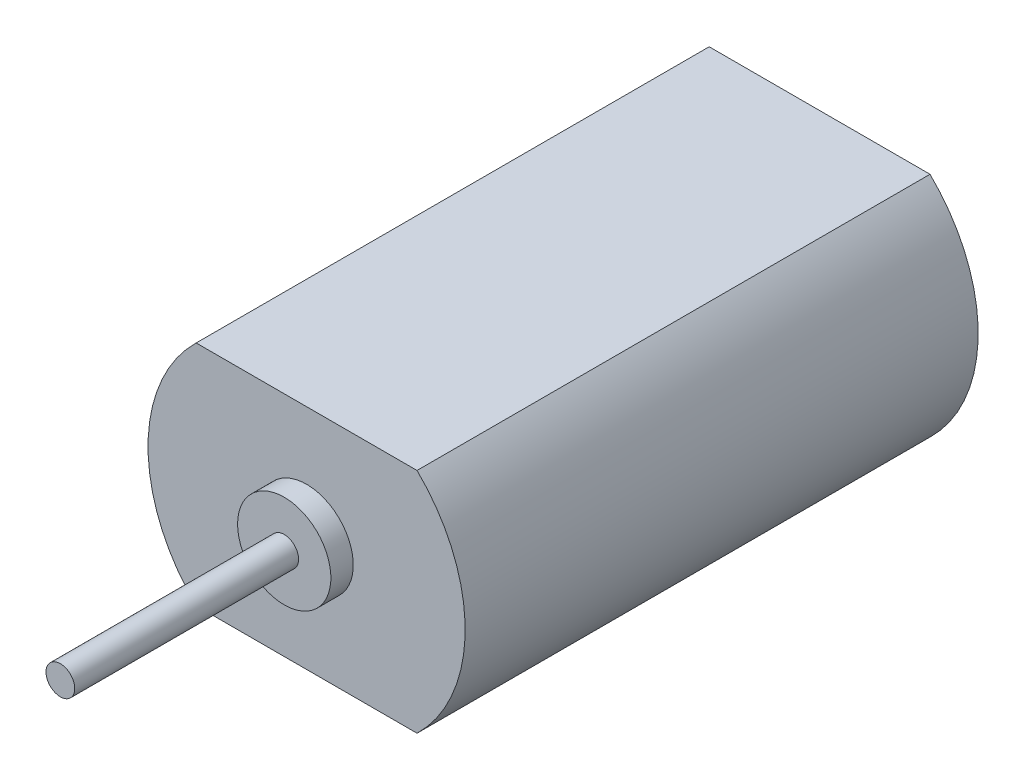
ISO-10303-21;
HEADER;
FILE_DESCRIPTION(('STEP AP214'),'2;1');
FILE_NAME('part.step','',(''),(''),'','','');
FILE_SCHEMA(('AUTOMOTIVE_DESIGN { 1 0 10303 214 1 1 1 1 }'));
ENDSEC;
DATA;
#1=APPLICATION_CONTEXT('core data for automotive mechanical design processes');
#2=APPLICATION_PROTOCOL_DEFINITION('international standard','automotive_design',2000,#1);
#3=PRODUCT_CONTEXT('',#1,'mechanical');
#4=PRODUCT('Part','Part','',(#3));
#5=PRODUCT_RELATED_PRODUCT_CATEGORY('part','',(#4));
#6=PRODUCT_DEFINITION_FORMATION('','',#4);
#7=PRODUCT_DEFINITION_CONTEXT('part definition',#1,'design');
#8=PRODUCT_DEFINITION('design','',#6,#7);
#9=PRODUCT_DEFINITION_SHAPE('','',#8);
#10=(LENGTH_UNIT() NAMED_UNIT(*) SI_UNIT(.MILLI.,.METRE.));
#11=(NAMED_UNIT(*) PLANE_ANGLE_UNIT() SI_UNIT($,.RADIAN.));
#12=(NAMED_UNIT(*) SI_UNIT($,.STERADIAN.) SOLID_ANGLE_UNIT());
#13=UNCERTAINTY_MEASURE_WITH_UNIT(LENGTH_MEASURE(1.E-05),#10,'distance_accuracy_value','');
#14=(GEOMETRIC_REPRESENTATION_CONTEXT(3) GLOBAL_UNCERTAINTY_ASSIGNED_CONTEXT((#13)) GLOBAL_UNIT_ASSIGNED_CONTEXT((#10,
#11,#12)) REPRESENTATION_CONTEXT('',''));
#15=CARTESIAN_POINT('',(0.,0.,0.));
#16=DIRECTION('',(0.,0.,1.));
#17=DIRECTION('',(1.,0.,0.));
#18=AXIS2_PLACEMENT_3D('',#15,#16,#17);
#19=CARTESIAN_POINT('',(0.,0.,0.));
#20=DIRECTION('',(0.,0.,1.));
#21=DIRECTION('',(1.,0.,0.));
#22=AXIS2_PLACEMENT_3D('',#19,#20,#21);
#23=PLANE('',#22);
#24=DIRECTION('',(0.,-1.,0.));
#25=VECTOR('',#24,1.);
#26=CARTESIAN_POINT('',(8.001,1.016,0.));
#27=LINE('',#26,#25);
#28=CARTESIAN_POINT('',(8.001,1.016,0.));
#29=VERTEX_POINT('',#28);
#30=CARTESIAN_POINT('',(8.001,-1.016,0.));
#31=VERTEX_POINT('',#30);
#32=EDGE_CURVE('E146',#29,#31,#27,.T.);
#33=ORIENTED_EDGE('',*,*,#32,.F.);
#34=DIRECTION('',(1.,0.,0.));
#35=VECTOR('',#34,1.);
#36=CARTESIAN_POINT('',(8.001,1.016,0.));
#37=LINE('',#36,#35);
#38=CARTESIAN_POINT('',(6.985,1.016,0.));
#39=VERTEX_POINT('',#38);
#40=EDGE_CURVE('E159',#39,#29,#37,.T.);
#41=ORIENTED_EDGE('',*,*,#40,.F.);
#42=DIRECTION('',(0.,1.,0.));
#43=VECTOR('',#42,1.);
#44=CARTESIAN_POINT('',(6.985,1.016,0.));
#45=LINE('',#44,#43);
#46=CARTESIAN_POINT('',(6.985,-1.016,0.));
#47=VERTEX_POINT('',#46);
#48=EDGE_CURVE('E168',#47,#39,#45,.T.);
#49=ORIENTED_EDGE('',*,*,#48,.F.);
#50=DIRECTION('',(-1.,0.,0.));
#51=VECTOR('',#50,1.);
#52=CARTESIAN_POINT('',(8.001,-1.016,0.));
#53=LINE('',#52,#51);
#54=EDGE_CURVE('E149',#31,#47,#53,.T.);
#55=ORIENTED_EDGE('',*,*,#54,.F.);
#56=EDGE_LOOP('',(#33,#41,#49,#55));
#57=FACE_BOUND('',#56,.T.);
#58=CARTESIAN_POINT('',(0.,0.,0.));
#59=DIRECTION('',(0.,0.,1.));
#60=DIRECTION('',(1.,0.,0.));
#61=AXIS2_PLACEMENT_3D('',#58,#59,#60);
#62=CIRCLE('',#61,0.9779);
#63=CARTESIAN_POINT('',(0.9779,0.,0.));
#64=VERTEX_POINT('',#63);
#65=EDGE_CURVE('E11',#64,#64,#62,.F.);
#66=ORIENTED_EDGE('',*,*,#65,.F.);
#67=EDGE_LOOP('',(#66));
#68=FACE_BOUND('',#67,.T.);
#69=DIRECTION('',(1.,0.,0.));
#70=VECTOR('',#69,1.);
#71=CARTESIAN_POINT('',(0.,7.747,0.));
#72=LINE('',#71,#70);
#73=CARTESIAN_POINT('',(-7.51771348216996,7.747,0.));
#74=VERTEX_POINT('',#73);
#75=CARTESIAN_POINT('',(7.51771348216996,7.747,0.));
#76=VERTEX_POINT('',#75);
#77=EDGE_CURVE('E197',#74,#76,#72,.T.);
#78=ORIENTED_EDGE('',*,*,#77,.T.);
#79=CARTESIAN_POINT('',(0.,0.,0.));
#80=DIRECTION('',(0.,0.,1.));
#81=DIRECTION('',(1.,0.,0.));
#82=AXIS2_PLACEMENT_3D('',#79,#80,#81);
#83=CIRCLE('',#82,10.795);
#84=CARTESIAN_POINT('',(7.51771348216996,-7.747,0.));
#85=VERTEX_POINT('',#84);
#86=EDGE_CURVE('E204',#85,#76,#83,.T.);
#87=ORIENTED_EDGE('',*,*,#86,.F.);
#88=DIRECTION('',(-1.,0.,0.));
#89=VECTOR('',#88,1.);
#90=CARTESIAN_POINT('',(0.,-7.747,0.));
#91=LINE('',#90,#89);
#92=CARTESIAN_POINT('',(-7.51771348216996,-7.747,0.));
#93=VERTEX_POINT('',#92);
#94=EDGE_CURVE('E215',#85,#93,#91,.T.);
#95=ORIENTED_EDGE('',*,*,#94,.T.);
#96=EDGE_CURVE('E212',#74,#93,#83,.T.);
#97=ORIENTED_EDGE('',*,*,#96,.F.);
#98=EDGE_LOOP('',(#78,#87,#95,#97));
#99=FACE_BOUND('',#98,.T.);
#100=DIRECTION('',(0.,-1.,0.));
#101=VECTOR('',#100,1.);
#102=CARTESIAN_POINT('',(-6.985,1.016,0.));
#103=LINE('',#102,#101);
#104=CARTESIAN_POINT('',(-6.985,1.016,0.));
#105=VERTEX_POINT('',#104);
#106=CARTESIAN_POINT('',(-6.985,-1.016,0.));
#107=VERTEX_POINT('',#106);
#108=EDGE_CURVE('E145',#105,#107,#103,.T.);
#109=ORIENTED_EDGE('',*,*,#108,.F.);
#110=DIRECTION('',(1.,0.,0.));
#111=VECTOR('',#110,1.);
#112=CARTESIAN_POINT('',(-6.985,1.016,0.));
#113=LINE('',#112,#111);
#114=CARTESIAN_POINT('',(-8.001,1.016,0.));
#115=VERTEX_POINT('',#114);
#116=EDGE_CURVE('E142',#115,#105,#113,.T.);
#117=ORIENTED_EDGE('',*,*,#116,.F.);
#118=DIRECTION('',(0.,1.,0.));
#119=VECTOR('',#118,1.);
#120=CARTESIAN_POINT('',(-8.001,1.016,0.));
#121=LINE('',#120,#119);
#122=CARTESIAN_POINT('',(-8.001,-1.016,0.));
#123=VERTEX_POINT('',#122);
#124=EDGE_CURVE('E56',#123,#115,#121,.T.);
#125=ORIENTED_EDGE('',*,*,#124,.F.);
#126=DIRECTION('',(-1.,0.,0.));
#127=VECTOR('',#126,1.);
#128=CARTESIAN_POINT('',(-6.985,-1.016,0.));
#129=LINE('',#128,#127);
#130=EDGE_CURVE('E51',#107,#123,#129,.T.);
#131=ORIENTED_EDGE('',*,*,#130,.F.);
#132=EDGE_LOOP('',(#109,#117,#125,#131));
#133=FACE_BOUND('',#132,.T.);
#134=ADVANCED_FACE('F36',(#57,#68,#99,#133),#23,.F.);
#135=CARTESIAN_POINT('',(0.,7.747,34.925));
#136=DIRECTION('',(0.,1.,0.));
#137=DIRECTION('',(0.,0.,1.));
#138=AXIS2_PLACEMENT_3D('',#135,#136,#137);
#139=PLANE('',#138);
#140=ORIENTED_EDGE('',*,*,#77,.F.);
#141=DIRECTION('',(0.,0.,-1.));
#142=VECTOR('',#141,1.);
#143=CARTESIAN_POINT('',(-7.51771348216996,7.747,34.925));
#144=LINE('',#143,#142);
#145=CARTESIAN_POINT('',(-7.51771348216996,7.747,34.925));
#146=VERTEX_POINT('',#145);
#147=EDGE_CURVE('E44',#146,#74,#144,.T.);
#148=ORIENTED_EDGE('',*,*,#147,.F.);
#149=DIRECTION('',(1.,0.,0.));
#150=VECTOR('',#149,1.);
#151=CARTESIAN_POINT('',(0.,7.747,34.925));
#152=LINE('',#151,#150);
#153=CARTESIAN_POINT('',(7.51771348216996,7.747,34.925));
#154=VERTEX_POINT('',#153);
#155=EDGE_CURVE('E200',#146,#154,#152,.T.);
#156=ORIENTED_EDGE('',*,*,#155,.T.);
#157=DIRECTION('',(0.,0.,-1.));
#158=VECTOR('',#157,1.);
#159=CARTESIAN_POINT('',(7.51771348216996,7.747,34.925));
#160=LINE('',#159,#158);
#161=EDGE_CURVE('E218',#154,#76,#160,.T.);
#162=ORIENTED_EDGE('',*,*,#161,.T.);
#163=EDGE_LOOP('',(#140,#148,#156,#162));
#164=FACE_BOUND('',#163,.T.);
#165=ADVANCED_FACE('F38',(#164),#139,.T.);
#166=CARTESIAN_POINT('',(0.,0.,34.925));
#167=DIRECTION('',(0.,0.,-1.));
#168=DIRECTION('',(-1.,0.,0.));
#169=AXIS2_PLACEMENT_3D('',#166,#167,#168);
#170=CYLINDRICAL_SURFACE('',#169,10.795);
#171=ORIENTED_EDGE('',*,*,#96,.T.);
#172=DIRECTION('',(0.,0.,-1.));
#173=VECTOR('',#172,1.);
#174=CARTESIAN_POINT('',(-7.51771348216996,-7.747,34.925));
#175=LINE('',#174,#173);
#176=CARTESIAN_POINT('',(-7.51771348216996,-7.747,34.925));
#177=VERTEX_POINT('',#176);
#178=EDGE_CURVE('E222',#177,#93,#175,.T.);
#179=ORIENTED_EDGE('',*,*,#178,.F.);
#180=CARTESIAN_POINT('',(0.,0.,34.925));
#181=DIRECTION('',(0.,0.,1.));
#182=DIRECTION('',(1.,0.,0.));
#183=AXIS2_PLACEMENT_3D('',#180,#181,#182);
#184=CIRCLE('',#183,10.795);
#185=EDGE_CURVE('E203',#146,#177,#184,.T.);
#186=ORIENTED_EDGE('',*,*,#185,.F.);
#187=ORIENTED_EDGE('',*,*,#147,.T.);
#188=EDGE_LOOP('',(#171,#179,#186,#187));
#189=FACE_BOUND('',#188,.T.);
#190=ADVANCED_FACE('F226',(#189),#170,.T.);
#191=CARTESIAN_POINT('',(0.,-7.747,34.925));
#192=DIRECTION('',(0.,-1.,0.));
#193=DIRECTION('',(0.,0.,-1.));
#194=AXIS2_PLACEMENT_3D('',#191,#192,#193);
#195=PLANE('',#194);
#196=ORIENTED_EDGE('',*,*,#94,.F.);
#197=DIRECTION('',(0.,0.,-1.));
#198=VECTOR('',#197,1.);
#199=CARTESIAN_POINT('',(7.51771348216996,-7.747,34.925));
#200=LINE('',#199,#198);
#201=CARTESIAN_POINT('',(7.51771348216996,-7.747,34.925));
#202=VERTEX_POINT('',#201);
#203=EDGE_CURVE('E220',#202,#85,#200,.T.);
#204=ORIENTED_EDGE('',*,*,#203,.F.);
#205=DIRECTION('',(-1.,0.,0.));
#206=VECTOR('',#205,1.);
#207=CARTESIAN_POINT('',(0.,-7.747,34.925));
#208=LINE('',#207,#206);
#209=EDGE_CURVE('E206',#202,#177,#208,.T.);
#210=ORIENTED_EDGE('',*,*,#209,.T.);
#211=ORIENTED_EDGE('',*,*,#178,.T.);
#212=EDGE_LOOP('',(#196,#204,#210,#211));
#213=FACE_BOUND('',#212,.T.);
#214=ADVANCED_FACE('F240',(#213),#195,.T.);
#215=ORIENTED_EDGE('',*,*,#86,.T.);
#216=ORIENTED_EDGE('',*,*,#161,.F.);
#217=EDGE_CURVE('E207',#202,#154,#184,.T.);
#218=ORIENTED_EDGE('',*,*,#217,.F.);
#219=ORIENTED_EDGE('',*,*,#203,.T.);
#220=EDGE_LOOP('',(#215,#216,#218,#219));
#221=FACE_BOUND('',#220,.T.);
#222=ADVANCED_FACE('F238',(#221),#170,.T.);
#223=CARTESIAN_POINT('',(0.,0.,34.925));
#224=DIRECTION('',(0.,0.,1.));
#225=DIRECTION('',(1.,0.,0.));
#226=AXIS2_PLACEMENT_3D('',#223,#224,#225);
#227=PLANE('',#226);
#228=CARTESIAN_POINT('',(0.,0.,34.925));
#229=DIRECTION('',(0.,0.,1.));
#230=DIRECTION('',(1.,0.,0.));
#231=AXIS2_PLACEMENT_3D('',#228,#229,#230);
#232=CIRCLE('',#231,3.175);
#233=CARTESIAN_POINT('',(-3.175,0.,34.925));
#234=VERTEX_POINT('',#233);
#235=EDGE_CURVE('E191',#234,#234,#232,.T.);
#236=ORIENTED_EDGE('',*,*,#235,.F.);
#237=EDGE_LOOP('',(#236));
#238=FACE_BOUND('',#237,.T.);
#239=ORIENTED_EDGE('',*,*,#155,.F.);
#240=ORIENTED_EDGE('',*,*,#185,.T.);
#241=ORIENTED_EDGE('',*,*,#209,.F.);
#242=ORIENTED_EDGE('',*,*,#217,.T.);
#243=EDGE_LOOP('',(#239,#240,#241,#242));
#244=FACE_BOUND('',#243,.T.);
#245=ADVANCED_FACE('F243',(#238,#244),#227,.T.);
#246=CARTESIAN_POINT('',(0.,0.,36.449));
#247=DIRECTION('',(0.,0.,-1.));
#248=DIRECTION('',(-1.,0.,0.));
#249=AXIS2_PLACEMENT_3D('',#246,#247,#248);
#250=CYLINDRICAL_SURFACE('',#249,3.175);
#251=CARTESIAN_POINT('',(0.,0.,36.449));
#252=DIRECTION('',(0.,0.,1.));
#253=DIRECTION('',(1.,0.,0.));
#254=AXIS2_PLACEMENT_3D('',#251,#252,#253);
#255=CIRCLE('',#254,3.175);
#256=CARTESIAN_POINT('',(-3.175,0.,36.449));
#257=VERTEX_POINT('',#256);
#258=EDGE_CURVE('E194',#257,#257,#255,.T.);
#259=CARTESIAN_POINT('',(-3.175,0.,36.449));
#260=CARTESIAN_POINT('',(-3.175,0.,36.433125));
#261=CARTESIAN_POINT('',(-3.175,0.,36.41725));
#262=CARTESIAN_POINT('',(-3.175,0.,36.3855));
#263=CARTESIAN_POINT('',(-3.175,0.,36.369625));
#264=CARTESIAN_POINT('',(-3.175,0.,36.337875));
#265=CARTESIAN_POINT('',(-3.175,0.,36.322));
#266=CARTESIAN_POINT('',(-3.175,0.,36.29025));
#267=CARTESIAN_POINT('',(-3.175,0.,36.274375));
#268=CARTESIAN_POINT('',(-3.175,0.,36.242625));
#269=CARTESIAN_POINT('',(-3.175,0.,36.22675));
#270=CARTESIAN_POINT('',(-3.175,0.,36.195));
#271=CARTESIAN_POINT('',(-3.175,0.,36.179125));
#272=CARTESIAN_POINT('',(-3.175,0.,36.147375));
#273=CARTESIAN_POINT('',(-3.175,0.,36.1315));
#274=CARTESIAN_POINT('',(-3.175,0.,36.09975));
#275=CARTESIAN_POINT('',(-3.175,0.,36.083875));
#276=CARTESIAN_POINT('',(-3.175,0.,36.052125));
#277=CARTESIAN_POINT('',(-3.175,0.,36.03625));
#278=CARTESIAN_POINT('',(-3.175,0.,36.0045));
#279=CARTESIAN_POINT('',(-3.175,0.,35.988625));
#280=CARTESIAN_POINT('',(-3.175,0.,35.956875));
#281=CARTESIAN_POINT('',(-3.175,0.,35.941));
#282=CARTESIAN_POINT('',(-3.175,0.,35.90925));
#283=CARTESIAN_POINT('',(-3.175,0.,35.893375));
#284=CARTESIAN_POINT('',(-3.175,0.,35.861625));
#285=CARTESIAN_POINT('',(-3.175,0.,35.84575));
#286=CARTESIAN_POINT('',(-3.175,0.,35.814));
#287=CARTESIAN_POINT('',(-3.175,0.,35.798125));
#288=CARTESIAN_POINT('',(-3.175,0.,35.766375));
#289=CARTESIAN_POINT('',(-3.175,0.,35.7505));
#290=CARTESIAN_POINT('',(-3.175,0.,35.71875));
#291=CARTESIAN_POINT('',(-3.175,0.,35.702875));
#292=CARTESIAN_POINT('',(-3.175,0.,35.671125));
#293=CARTESIAN_POINT('',(-3.175,0.,35.65525));
#294=CARTESIAN_POINT('',(-3.175,0.,35.6235));
#295=CARTESIAN_POINT('',(-3.175,0.,35.607625));
#296=CARTESIAN_POINT('',(-3.175,0.,35.575875));
#297=CARTESIAN_POINT('',(-3.175,0.,35.56));
#298=CARTESIAN_POINT('',(-3.175,0.,35.52825));
#299=CARTESIAN_POINT('',(-3.175,0.,35.512375));
#300=CARTESIAN_POINT('',(-3.175,0.,35.480625));
#301=CARTESIAN_POINT('',(-3.175,0.,35.46475));
#302=CARTESIAN_POINT('',(-3.175,0.,35.433));
#303=CARTESIAN_POINT('',(-3.175,0.,35.417125));
#304=CARTESIAN_POINT('',(-3.175,0.,35.385375));
#305=CARTESIAN_POINT('',(-3.175,0.,35.3695));
#306=CARTESIAN_POINT('',(-3.175,0.,35.33775));
#307=CARTESIAN_POINT('',(-3.175,0.,35.321875));
#308=CARTESIAN_POINT('',(-3.175,0.,35.290125));
#309=CARTESIAN_POINT('',(-3.175,0.,35.27425));
#310=CARTESIAN_POINT('',(-3.175,0.,35.2425));
#311=CARTESIAN_POINT('',(-3.175,0.,35.226625));
#312=CARTESIAN_POINT('',(-3.175,0.,35.194875));
#313=CARTESIAN_POINT('',(-3.175,0.,35.179));
#314=CARTESIAN_POINT('',(-3.175,0.,35.14725));
#315=CARTESIAN_POINT('',(-3.175,0.,35.131375));
#316=CARTESIAN_POINT('',(-3.175,0.,35.099625));
#317=CARTESIAN_POINT('',(-3.175,0.,35.08375));
#318=CARTESIAN_POINT('',(-3.175,0.,35.052));
#319=CARTESIAN_POINT('',(-3.175,0.,35.036125));
#320=CARTESIAN_POINT('',(-3.175,0.,35.004375));
#321=CARTESIAN_POINT('',(-3.175,0.,34.9885));
#322=CARTESIAN_POINT('',(-3.175,0.,34.95675));
#323=CARTESIAN_POINT('',(-3.175,0.,34.940875));
#324=CARTESIAN_POINT('',(-3.175,0.,34.925));
#325=B_SPLINE_CURVE_WITH_KNOTS('',3,(#259,#260,#261,#262,#263,#264,#265,#266,#267,#268,#269,
#270,#271,#272,#273,#274,#275,#276,#277,#278,#279,#280,#281,#282,#283,#284,#285,#286,#287,#288,
#289,#290,#291,#292,#293,#294,#295,#296,#297,#298,#299,#300,#301,#302,#303,#304,#305,#306,#307,
#308,#309,#310,#311,#312,#313,#314,#315,#316,#317,#318,#319,#320,#321,#322,#323,#324),
.UNSPECIFIED.,.F.,.F.,(4,2,2,2,2,2,2,2,2,2,2,2,2,2,2,2,2,2,2,2,2,2,2,2,2,2,2,2,2,2,2,2,4),(0.,
0.0476249999999956,0.0952499999999981,0.142874999999994,0.190499999999996,0.238124999999999,
0.285749999999994,0.333374999999997,0.380999999999999,0.428624999999995,0.476249999999998,
0.523874999999993,0.571499999999996,0.619124999999998,0.666749999999994,0.714374999999996,
0.761999999999999,0.809624999999994,0.857249999999997,0.904874999999993,0.952499999999995,
1.000125,1.04774999999999,1.095375,1.143,1.19062499999999,1.23825,1.28587499999999,
1.33349999999999,1.381125,1.42874999999999,1.476375,1.524),.UNSPECIFIED.);
#326=EDGE_CURVE('BSEAM245',#257,#234,#325,.T.);
#327=ORIENTED_EDGE('',*,*,#258,.F.);
#328=ORIENTED_EDGE('',*,*,#235,.T.);
#329=ORIENTED_EDGE('',*,*,#326,.T.);
#330=ORIENTED_EDGE('',*,*,#326,.F.);
#331=EDGE_LOOP('',(#327,#329,#328,#330));
#332=FACE_BOUND('',#331,.T.);
#333=ADVANCED_FACE('F245',(#332),#250,.T.);
#334=CARTESIAN_POINT('',(0.,0.,36.449));
#335=DIRECTION('',(0.,0.,1.));
#336=DIRECTION('',(1.,0.,0.));
#337=AXIS2_PLACEMENT_3D('',#334,#335,#336);
#338=PLANE('',#337);
#339=CARTESIAN_POINT('',(0.,0.,36.449));
#340=DIRECTION('',(0.,0.,1.));
#341=DIRECTION('',(1.,0.,0.));
#342=AXIS2_PLACEMENT_3D('',#339,#340,#341);
#343=CIRCLE('',#342,0.9779);
#344=CARTESIAN_POINT('',(-0.9779,0.,36.449));
#345=VERTEX_POINT('',#344);
#346=EDGE_CURVE('E187',#345,#345,#343,.T.);
#347=ORIENTED_EDGE('',*,*,#346,.F.);
#348=EDGE_LOOP('',(#347));
#349=FACE_BOUND('',#348,.T.);
#350=ORIENTED_EDGE('',*,*,#258,.T.);
#351=EDGE_LOOP('',(#350));
#352=FACE_BOUND('',#351,.T.);
#353=ADVANCED_FACE('F252',(#349,#352),#338,.T.);
#354=CARTESIAN_POINT('',(0.,0.,51.689));
#355=DIRECTION('',(0.,0.,-1.));
#356=DIRECTION('',(-1.,0.,0.));
#357=AXIS2_PLACEMENT_3D('',#354,#355,#356);
#358=CYLINDRICAL_SURFACE('',#357,0.9779);
#359=CARTESIAN_POINT('',(0.,0.,51.689));
#360=DIRECTION('',(0.,0.,1.));
#361=DIRECTION('',(1.,0.,0.));
#362=AXIS2_PLACEMENT_3D('',#359,#360,#361);
#363=CIRCLE('',#362,0.9779);
#364=CARTESIAN_POINT('',(-0.9779,0.,51.689));
#365=VERTEX_POINT('',#364);
#366=EDGE_CURVE('E188',#365,#365,#363,.T.);
#367=CARTESIAN_POINT('',(-0.9779,0.,51.689));
#368=CARTESIAN_POINT('',(-0.9779,0.,51.53025));
#369=CARTESIAN_POINT('',(-0.9779,0.,51.3715));
#370=CARTESIAN_POINT('',(-0.9779,0.,51.054));
#371=CARTESIAN_POINT('',(-0.9779,0.,50.89525));
#372=CARTESIAN_POINT('',(-0.9779,0.,50.57775));
#373=CARTESIAN_POINT('',(-0.9779,0.,50.419));
#374=CARTESIAN_POINT('',(-0.9779,0.,50.1015));
#375=CARTESIAN_POINT('',(-0.9779,0.,49.94275));
#376=CARTESIAN_POINT('',(-0.9779,0.,49.62525));
#377=CARTESIAN_POINT('',(-0.9779,0.,49.4665));
#378=CARTESIAN_POINT('',(-0.9779,0.,49.149));
#379=CARTESIAN_POINT('',(-0.9779,0.,48.99025));
#380=CARTESIAN_POINT('',(-0.9779,0.,48.67275));
#381=CARTESIAN_POINT('',(-0.9779,0.,48.514));
#382=CARTESIAN_POINT('',(-0.9779,0.,48.1965));
#383=CARTESIAN_POINT('',(-0.9779,0.,48.03775));
#384=CARTESIAN_POINT('',(-0.9779,0.,47.72025));
#385=CARTESIAN_POINT('',(-0.9779,0.,47.5615));
#386=CARTESIAN_POINT('',(-0.9779,0.,47.244));
#387=CARTESIAN_POINT('',(-0.9779,0.,47.08525));
#388=CARTESIAN_POINT('',(-0.9779,0.,46.76775));
#389=CARTESIAN_POINT('',(-0.9779,0.,46.609));
#390=CARTESIAN_POINT('',(-0.9779,0.,46.2915));
#391=CARTESIAN_POINT('',(-0.9779,0.,46.13275));
#392=CARTESIAN_POINT('',(-0.9779,0.,45.81525));
#393=CARTESIAN_POINT('',(-0.9779,0.,45.6565));
#394=CARTESIAN_POINT('',(-0.9779,0.,45.339));
#395=CARTESIAN_POINT('',(-0.9779,0.,45.18025));
#396=CARTESIAN_POINT('',(-0.9779,0.,44.86275));
#397=CARTESIAN_POINT('',(-0.9779,0.,44.704));
#398=CARTESIAN_POINT('',(-0.9779,0.,44.3865));
#399=CARTESIAN_POINT('',(-0.9779,0.,44.22775));
#400=CARTESIAN_POINT('',(-0.9779,0.,43.91025));
#401=CARTESIAN_POINT('',(-0.9779,0.,43.7515));
#402=CARTESIAN_POINT('',(-0.9779,0.,43.434));
#403=CARTESIAN_POINT('',(-0.9779,0.,43.27525));
#404=CARTESIAN_POINT('',(-0.9779,0.,42.95775));
#405=CARTESIAN_POINT('',(-0.9779,0.,42.799));
#406=CARTESIAN_POINT('',(-0.9779,0.,42.4815));
#407=CARTESIAN_POINT('',(-0.9779,0.,42.32275));
#408=CARTESIAN_POINT('',(-0.9779,0.,42.00525));
#409=CARTESIAN_POINT('',(-0.9779,0.,41.8465));
#410=CARTESIAN_POINT('',(-0.9779,0.,41.529));
#411=CARTESIAN_POINT('',(-0.9779,0.,41.37025));
#412=CARTESIAN_POINT('',(-0.9779,0.,41.05275));
#413=CARTESIAN_POINT('',(-0.9779,0.,40.894));
#414=CARTESIAN_POINT('',(-0.9779,0.,40.5765));
#415=CARTESIAN_POINT('',(-0.9779,0.,40.41775));
#416=CARTESIAN_POINT('',(-0.9779,0.,40.10025));
#417=CARTESIAN_POINT('',(-0.9779,0.,39.9415));
#418=CARTESIAN_POINT('',(-0.9779,0.,39.624));
#419=CARTESIAN_POINT('',(-0.9779,0.,39.46525));
#420=CARTESIAN_POINT('',(-0.9779,0.,39.14775));
#421=CARTESIAN_POINT('',(-0.9779,0.,38.989));
#422=CARTESIAN_POINT('',(-0.9779,0.,38.6715));
#423=CARTESIAN_POINT('',(-0.9779,0.,38.51275));
#424=CARTESIAN_POINT('',(-0.9779,0.,38.19525));
#425=CARTESIAN_POINT('',(-0.9779,0.,38.0365));
#426=CARTESIAN_POINT('',(-0.9779,0.,37.719));
#427=CARTESIAN_POINT('',(-0.9779,0.,37.56025));
#428=CARTESIAN_POINT('',(-0.9779,0.,37.24275));
#429=CARTESIAN_POINT('',(-0.9779,0.,37.084));
#430=CARTESIAN_POINT('',(-0.9779,0.,36.7665));
#431=CARTESIAN_POINT('',(-0.9779,0.,36.60775));
#432=CARTESIAN_POINT('',(-0.9779,0.,36.449));
#433=B_SPLINE_CURVE_WITH_KNOTS('',3,(#367,#368,#369,#370,#371,#372,#373,#374,#375,#376,#377,
#378,#379,#380,#381,#382,#383,#384,#385,#386,#387,#388,#389,#390,#391,#392,#393,#394,#395,#396,
#397,#398,#399,#400,#401,#402,#403,#404,#405,#406,#407,#408,#409,#410,#411,#412,#413,#414,#415,
#416,#417,#418,#419,#420,#421,#422,#423,#424,#425,#426,#427,#428,#429,#430,#431,#432),
.UNSPECIFIED.,.F.,.F.,(4,2,2,2,2,2,2,2,2,2,2,2,2,2,2,2,2,2,2,2,2,2,2,2,2,2,2,2,2,2,2,2,4),(0.,
0.476249999999998,0.952499999999995,1.42875,1.905,2.38124999999999,2.8575,3.33375,
3.80999999999999,4.28625,4.7625,5.23874999999999,5.715,6.19125,6.66749999999999,7.14375,
7.61999999999999,8.09624999999999,8.5725,9.04874999999999,9.52499999999999,10.00125,10.4775,
10.95375,11.43,11.90625,12.3825,12.85875,13.335,13.81125,14.2875,14.76375,15.24),.UNSPECIFIED.);
#434=EDGE_CURVE('BSEAM304',#365,#345,#433,.T.);
#435=ORIENTED_EDGE('',*,*,#366,.F.);
#436=ORIENTED_EDGE('',*,*,#346,.T.);
#437=ORIENTED_EDGE('',*,*,#434,.T.);
#438=ORIENTED_EDGE('',*,*,#434,.F.);
#439=EDGE_LOOP('',(#435,#437,#436,#438));
#440=FACE_BOUND('',#439,.T.);
#441=ADVANCED_FACE('F304',(#440),#358,.T.);
#442=CARTESIAN_POINT('',(0.,0.,51.689));
#443=DIRECTION('',(0.,0.,1.));
#444=DIRECTION('',(1.,0.,0.));
#445=AXIS2_PLACEMENT_3D('',#442,#443,#444);
#446=PLANE('',#445);
#447=ORIENTED_EDGE('',*,*,#366,.T.);
#448=EDGE_LOOP('',(#447));
#449=FACE_BOUND('',#448,.T.);
#450=ADVANCED_FACE('F313',(#449),#446,.T.);
#451=CARTESIAN_POINT('',(0.,0.,-6.35));
#452=DIRECTION('',(0.,0.,1.));
#453=DIRECTION('',(1.,0.,0.));
#454=AXIS2_PLACEMENT_3D('',#451,#452,#453);
#455=CYLINDRICAL_SURFACE('',#454,0.9779);
#456=CARTESIAN_POINT('',(0.,0.,-6.35));
#457=DIRECTION('',(0.,0.,-1.));
#458=DIRECTION('',(-1.,0.,0.));
#459=AXIS2_PLACEMENT_3D('',#456,#457,#458);
#460=CIRCLE('',#459,0.9779);
#461=CARTESIAN_POINT('',(-0.9779,0.,-6.35));
#462=VERTEX_POINT('',#461);
#463=EDGE_CURVE('E184',#462,#462,#460,.T.);
#464=ORIENTED_EDGE('',*,*,#463,.F.);
#465=EDGE_LOOP('',(#464));
#466=FACE_BOUND('',#465,.T.);
#467=ORIENTED_EDGE('',*,*,#65,.T.);
#468=EDGE_LOOP('',(#467));
#469=FACE_BOUND('',#468,.T.);
#470=ADVANCED_FACE('F322',(#466,#469),#455,.T.);
#471=CARTESIAN_POINT('',(0.,0.,-6.35));
#472=DIRECTION('',(0.,0.,-1.));
#473=DIRECTION('',(-1.,0.,0.));
#474=AXIS2_PLACEMENT_3D('',#471,#472,#473);
#475=PLANE('',#474);
#476=ORIENTED_EDGE('',*,*,#463,.T.);
#477=EDGE_LOOP('',(#476));
#478=FACE_BOUND('',#477,.T.);
#479=ADVANCED_FACE('F331',(#478),#475,.T.);
#480=CARTESIAN_POINT('',(8.001,1.016,-2.032));
#481=DIRECTION('',(-1.,0.,0.));
#482=DIRECTION('',(0.,0.,1.));
#483=AXIS2_PLACEMENT_3D('',#480,#481,#482);
#484=PLANE('',#483);
#485=ORIENTED_EDGE('',*,*,#32,.T.);
#486=DIRECTION('',(0.,0.,1.));
#487=VECTOR('',#486,1.);
#488=CARTESIAN_POINT('',(8.001,-1.016,-2.032));
#489=LINE('',#488,#487);
#490=CARTESIAN_POINT('',(8.001,-1.016,-2.032));
#491=VERTEX_POINT('',#490);
#492=EDGE_CURVE('E181',#491,#31,#489,.T.);
#493=ORIENTED_EDGE('',*,*,#492,.F.);
#494=DIRECTION('',(0.,-1.,0.));
#495=VECTOR('',#494,1.);
#496=CARTESIAN_POINT('',(8.001,1.016,-2.032));
#497=LINE('',#496,#495);
#498=CARTESIAN_POINT('',(8.001,1.016,-2.032));
#499=VERTEX_POINT('',#498);
#500=EDGE_CURVE('E155',#499,#491,#497,.T.);
#501=ORIENTED_EDGE('',*,*,#500,.F.);
#502=DIRECTION('',(0.,0.,1.));
#503=VECTOR('',#502,1.);
#504=CARTESIAN_POINT('',(8.001,1.016,-2.032));
#505=LINE('',#504,#503);
#506=EDGE_CURVE('E164',#499,#29,#505,.T.);
#507=ORIENTED_EDGE('',*,*,#506,.T.);
#508=EDGE_LOOP('',(#485,#493,#501,#507));
#509=FACE_BOUND('',#508,.T.);
#510=ADVANCED_FACE('F340',(#509),#484,.F.);
#511=CARTESIAN_POINT('',(8.001,-1.016,-2.032));
#512=DIRECTION('',(0.,1.,0.));
#513=DIRECTION('',(0.,0.,1.));
#514=AXIS2_PLACEMENT_3D('',#511,#512,#513);
#515=PLANE('',#514);
#516=ORIENTED_EDGE('',*,*,#54,.T.);
#517=DIRECTION('',(0.,0.,1.));
#518=VECTOR('',#517,1.);
#519=CARTESIAN_POINT('',(6.985,-1.016,-2.032));
#520=LINE('',#519,#518);
#521=CARTESIAN_POINT('',(6.985,-1.016,-2.032));
#522=VERTEX_POINT('',#521);
#523=EDGE_CURVE('E178',#522,#47,#520,.T.);
#524=ORIENTED_EDGE('',*,*,#523,.F.);
#525=DIRECTION('',(-1.,0.,0.));
#526=VECTOR('',#525,1.);
#527=CARTESIAN_POINT('',(8.001,-1.016,-2.032));
#528=LINE('',#527,#526);
#529=EDGE_CURVE('E158',#491,#522,#528,.T.);
#530=ORIENTED_EDGE('',*,*,#529,.F.);
#531=ORIENTED_EDGE('',*,*,#492,.T.);
#532=EDGE_LOOP('',(#516,#524,#530,#531));
#533=FACE_BOUND('',#532,.T.);
#534=ADVANCED_FACE('F353',(#533),#515,.F.);
#535=CARTESIAN_POINT('',(6.985,1.016,-2.032));
#536=DIRECTION('',(1.,0.,0.));
#537=DIRECTION('',(0.,0.,-1.));
#538=AXIS2_PLACEMENT_3D('',#535,#536,#537);
#539=PLANE('',#538);
#540=ORIENTED_EDGE('',*,*,#48,.T.);
#541=DIRECTION('',(0.,0.,1.));
#542=VECTOR('',#541,1.);
#543=CARTESIAN_POINT('',(6.985,1.016,-2.032));
#544=LINE('',#543,#542);
#545=CARTESIAN_POINT('',(6.985,1.016,-2.032));
#546=VERTEX_POINT('',#545);
#547=EDGE_CURVE('E175',#546,#39,#544,.T.);
#548=ORIENTED_EDGE('',*,*,#547,.F.);
#549=DIRECTION('',(0.,1.,0.));
#550=VECTOR('',#549,1.);
#551=CARTESIAN_POINT('',(6.985,1.016,-2.032));
#552=LINE('',#551,#550);
#553=EDGE_CURVE('E161',#522,#546,#552,.T.);
#554=ORIENTED_EDGE('',*,*,#553,.F.);
#555=ORIENTED_EDGE('',*,*,#523,.T.);
#556=EDGE_LOOP('',(#540,#548,#554,#555));
#557=FACE_BOUND('',#556,.T.);
#558=ADVANCED_FACE('F362',(#557),#539,.F.);
#559=CARTESIAN_POINT('',(8.001,1.016,-2.032));
#560=DIRECTION('',(0.,-1.,0.));
#561=DIRECTION('',(0.,0.,-1.));
#562=AXIS2_PLACEMENT_3D('',#559,#560,#561);
#563=PLANE('',#562);
#564=ORIENTED_EDGE('',*,*,#40,.T.);
#565=ORIENTED_EDGE('',*,*,#506,.F.);
#566=DIRECTION('',(1.,0.,0.));
#567=VECTOR('',#566,1.);
#568=CARTESIAN_POINT('',(8.001,1.016,-2.032));
#569=LINE('',#568,#567);
#570=EDGE_CURVE('E163',#546,#499,#569,.T.);
#571=ORIENTED_EDGE('',*,*,#570,.F.);
#572=ORIENTED_EDGE('',*,*,#547,.T.);
#573=EDGE_LOOP('',(#564,#565,#571,#572));
#574=FACE_BOUND('',#573,.T.);
#575=ADVANCED_FACE('F371',(#574),#563,.F.);
#576=CARTESIAN_POINT('',(0.,0.,-2.032));
#577=DIRECTION('',(0.,0.,-1.));
#578=DIRECTION('',(-1.,0.,0.));
#579=AXIS2_PLACEMENT_3D('',#576,#577,#578);
#580=PLANE('',#579);
#581=ORIENTED_EDGE('',*,*,#500,.T.);
#582=ORIENTED_EDGE('',*,*,#529,.T.);
#583=ORIENTED_EDGE('',*,*,#553,.T.);
#584=ORIENTED_EDGE('',*,*,#570,.T.);
#585=EDGE_LOOP('',(#581,#582,#583,#584));
#586=FACE_BOUND('',#585,.T.);
#587=ADVANCED_FACE('F380',(#586),#580,.T.);
#588=CARTESIAN_POINT('',(-6.985,1.016,-2.032));
#589=DIRECTION('',(-1.,0.,0.));
#590=DIRECTION('',(0.,0.,1.));
#591=AXIS2_PLACEMENT_3D('',#588,#589,#590);
#592=PLANE('',#591);
#593=ORIENTED_EDGE('',*,*,#108,.T.);
#594=DIRECTION('',(0.,0.,1.));
#595=VECTOR('',#594,1.);
#596=CARTESIAN_POINT('',(-6.985,-1.016,-2.032));
#597=LINE('',#596,#595);
#598=CARTESIAN_POINT('',(-6.985,-1.016,-2.032));
#599=VERTEX_POINT('',#598);
#600=EDGE_CURVE('E126',#599,#107,#597,.T.);
#601=ORIENTED_EDGE('',*,*,#600,.F.);
#602=DIRECTION('',(0.,-1.,0.));
#603=VECTOR('',#602,1.);
#604=CARTESIAN_POINT('',(-6.985,1.016,-2.032));
#605=LINE('',#604,#603);
#606=CARTESIAN_POINT('',(-6.985,1.016,-2.032));
#607=VERTEX_POINT('',#606);
#608=EDGE_CURVE('E133',#607,#599,#605,.T.);
#609=ORIENTED_EDGE('',*,*,#608,.F.);
#610=DIRECTION('',(0.,0.,1.));
#611=VECTOR('',#610,1.);
#612=CARTESIAN_POINT('',(-6.985,1.016,-2.032));
#613=LINE('',#612,#611);
#614=EDGE_CURVE('E448',#607,#105,#613,.T.);
#615=ORIENTED_EDGE('',*,*,#614,.T.);
#616=EDGE_LOOP('',(#593,#601,#609,#615));
#617=FACE_BOUND('',#616,.T.);
#618=ADVANCED_FACE('F144',(#617),#592,.F.);
#619=CARTESIAN_POINT('',(-6.985,-1.016,-2.032));
#620=DIRECTION('',(0.,1.,0.));
#621=DIRECTION('',(0.,0.,1.));
#622=AXIS2_PLACEMENT_3D('',#619,#620,#621);
#623=PLANE('',#622);
#624=ORIENTED_EDGE('',*,*,#130,.T.);
#625=DIRECTION('',(0.,0.,1.));
#626=VECTOR('',#625,1.);
#627=CARTESIAN_POINT('',(-8.001,-1.016,-2.032));
#628=LINE('',#627,#626);
#629=CARTESIAN_POINT('',(-8.001,-1.016,-2.032));
#630=VERTEX_POINT('',#629);
#631=EDGE_CURVE('E129',#630,#123,#628,.T.);
#632=ORIENTED_EDGE('',*,*,#631,.F.);
#633=DIRECTION('',(-1.,0.,0.));
#634=VECTOR('',#633,1.);
#635=CARTESIAN_POINT('',(-6.985,-1.016,-2.032));
#636=LINE('',#635,#634);
#637=EDGE_CURVE('E122',#599,#630,#636,.T.);
#638=ORIENTED_EDGE('',*,*,#637,.F.);
#639=ORIENTED_EDGE('',*,*,#600,.T.);
#640=EDGE_LOOP('',(#624,#632,#638,#639));
#641=FACE_BOUND('',#640,.T.);
#642=ADVANCED_FACE('F124',(#641),#623,.F.);
#643=CARTESIAN_POINT('',(-8.001,1.016,-2.032));
#644=DIRECTION('',(1.,0.,0.));
#645=DIRECTION('',(0.,0.,-1.));
#646=AXIS2_PLACEMENT_3D('',#643,#644,#645);
#647=PLANE('',#646);
#648=ORIENTED_EDGE('',*,*,#124,.T.);
#649=DIRECTION('',(0.,0.,1.));
#650=VECTOR('',#649,1.);
#651=CARTESIAN_POINT('',(-8.001,1.016,-2.032));
#652=LINE('',#651,#650);
#653=CARTESIAN_POINT('',(-8.001,1.016,-2.032));
#654=VERTEX_POINT('',#653);
#655=EDGE_CURVE('E151',#654,#115,#652,.T.);
#656=ORIENTED_EDGE('',*,*,#655,.F.);
#657=DIRECTION('',(0.,1.,0.));
#658=VECTOR('',#657,1.);
#659=CARTESIAN_POINT('',(-8.001,1.016,-2.032));
#660=LINE('',#659,#658);
#661=EDGE_CURVE('E132',#630,#654,#660,.T.);
#662=ORIENTED_EDGE('',*,*,#661,.F.);
#663=ORIENTED_EDGE('',*,*,#631,.T.);
#664=EDGE_LOOP('',(#648,#656,#662,#663));
#665=FACE_BOUND('',#664,.T.);
#666=ADVANCED_FACE('F404',(#665),#647,.F.);
#667=CARTESIAN_POINT('',(-6.985,1.016,-2.032));
#668=DIRECTION('',(0.,-1.,0.));
#669=DIRECTION('',(0.,0.,-1.));
#670=AXIS2_PLACEMENT_3D('',#667,#668,#669);
#671=PLANE('',#670);
#672=ORIENTED_EDGE('',*,*,#116,.T.);
#673=ORIENTED_EDGE('',*,*,#614,.F.);
#674=DIRECTION('',(1.,0.,0.));
#675=VECTOR('',#674,1.);
#676=CARTESIAN_POINT('',(-6.985,1.016,-2.032));
#677=LINE('',#676,#675);
#678=EDGE_CURVE('E138',#654,#607,#677,.T.);
#679=ORIENTED_EDGE('',*,*,#678,.F.);
#680=ORIENTED_EDGE('',*,*,#655,.T.);
#681=EDGE_LOOP('',(#672,#673,#679,#680));
#682=FACE_BOUND('',#681,.T.);
#683=ADVANCED_FACE('F412',(#682),#671,.F.);
#684=CARTESIAN_POINT('',(0.,0.,-2.032));
#685=DIRECTION('',(0.,0.,-1.));
#686=DIRECTION('',(-1.,0.,0.));
#687=AXIS2_PLACEMENT_3D('',#684,#685,#686);
#688=PLANE('',#687);
#689=ORIENTED_EDGE('',*,*,#608,.T.);
#690=ORIENTED_EDGE('',*,*,#637,.T.);
#691=ORIENTED_EDGE('',*,*,#661,.T.);
#692=ORIENTED_EDGE('',*,*,#678,.T.);
#693=EDGE_LOOP('',(#689,#690,#691,#692));
#694=FACE_BOUND('',#693,.T.);
#695=ADVANCED_FACE('F136',(#694),#688,.T.);
#696=CLOSED_SHELL('',(#134,#165,#190,#214,#222,#245,#333,#353,#441,#450,#470,#479,#510,#534,
#558,#575,#587,#618,#642,#666,#683,#695));
#697=MANIFOLD_SOLID_BREP('B2',#696);
#698=ADVANCED_BREP_SHAPE_REPRESENTATION('',(#18,#697),#14);
#699=SHAPE_DEFINITION_REPRESENTATION(#9,#698);
ENDSEC;
END-ISO-10303-21;
